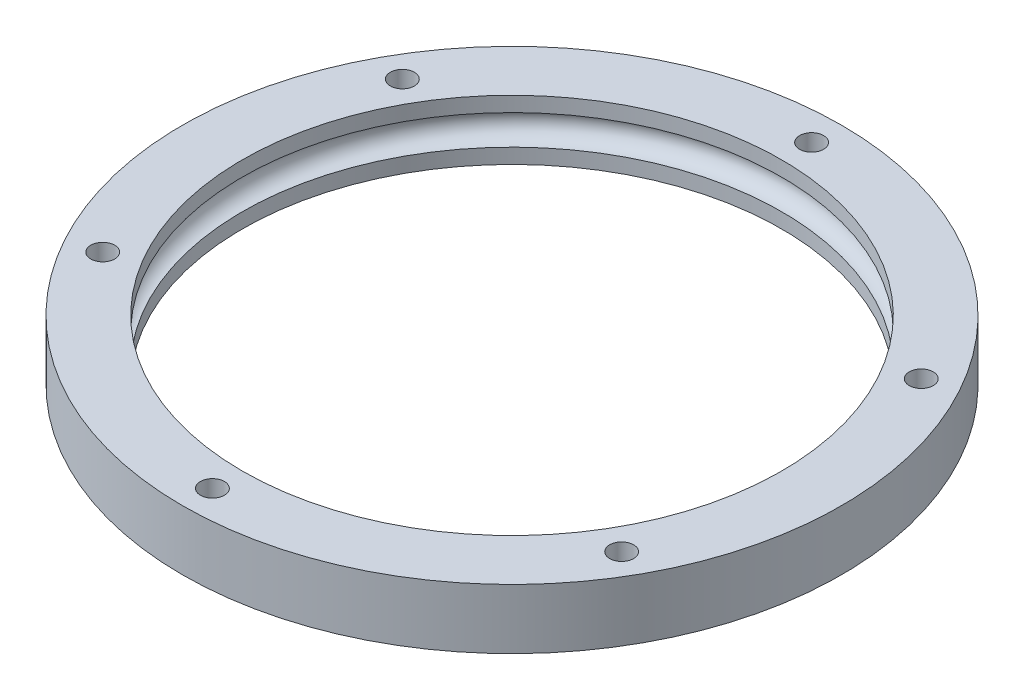
ISO-10303-21;
HEADER;
FILE_DESCRIPTION(('STEP AP214'),'2;1');
FILE_NAME('part.step','',(''),(''),'','','');
FILE_SCHEMA(('AUTOMOTIVE_DESIGN { 1 0 10303 214 1 1 1 1 }'));
ENDSEC;
DATA;
#1=APPLICATION_CONTEXT('core data for automotive mechanical design processes');
#2=APPLICATION_PROTOCOL_DEFINITION('international standard','automotive_design',2000,#1);
#3=PRODUCT_CONTEXT('',#1,'mechanical');
#4=PRODUCT('Part','Part','',(#3));
#5=PRODUCT_RELATED_PRODUCT_CATEGORY('part','',(#4));
#6=PRODUCT_DEFINITION_FORMATION('','',#4);
#7=PRODUCT_DEFINITION_CONTEXT('part definition',#1,'design');
#8=PRODUCT_DEFINITION('design','',#6,#7);
#9=PRODUCT_DEFINITION_SHAPE('','',#8);
#10=(LENGTH_UNIT() NAMED_UNIT(*) SI_UNIT(.MILLI.,.METRE.));
#11=(NAMED_UNIT(*) PLANE_ANGLE_UNIT() SI_UNIT($,.RADIAN.));
#12=(NAMED_UNIT(*) SI_UNIT($,.STERADIAN.) SOLID_ANGLE_UNIT());
#13=UNCERTAINTY_MEASURE_WITH_UNIT(LENGTH_MEASURE(1.E-05),#10,'distance_accuracy_value','');
#14=(GEOMETRIC_REPRESENTATION_CONTEXT(3) GLOBAL_UNCERTAINTY_ASSIGNED_CONTEXT((#13)) GLOBAL_UNIT_ASSIGNED_CONTEXT((#10,
#11,#12)) REPRESENTATION_CONTEXT('',''));
#15=CARTESIAN_POINT('',(0.,0.,0.));
#16=DIRECTION('',(0.,0.,1.));
#17=DIRECTION('',(1.,0.,0.));
#18=AXIS2_PLACEMENT_3D('',#15,#16,#17);
#19=CARTESIAN_POINT('',(0.,59.0708442602269,0.));
#20=DIRECTION('',(0.,1.,0.));
#21=DIRECTION('',(0.,0.,1.));
#22=AXIS2_PLACEMENT_3D('',#19,#20,#21);
#23=CYLINDRICAL_SURFACE('',#22,55.);
#24=CARTESIAN_POINT('',(0.,-5.,0.));
#25=DIRECTION('',(0.,1.,0.));
#26=DIRECTION('',(0.,0.,1.));
#27=AXIS2_PLACEMENT_3D('',#24,#25,#26);
#28=CIRCLE('',#27,55.);
#29=CARTESIAN_POINT('',(0.,-5.,55.));
#30=VERTEX_POINT('',#29);
#31=EDGE_CURVE('E10',#30,#30,#28,.T.);
#32=ORIENTED_EDGE('',*,*,#31,.T.);
#33=EDGE_LOOP('',(#32));
#34=FACE_BOUND('',#33,.T.);
#35=CARTESIAN_POINT('',(0.,5.,0.));
#36=DIRECTION('',(0.,1.,0.));
#37=DIRECTION('',(0.,0.,1.));
#38=AXIS2_PLACEMENT_3D('',#35,#36,#37);
#39=CIRCLE('',#38,55.);
#40=CARTESIAN_POINT('',(0.,5.,55.));
#41=VERTEX_POINT('',#40);
#42=EDGE_CURVE('E53',#41,#41,#39,.T.);
#43=ORIENTED_EDGE('',*,*,#42,.F.);
#44=EDGE_LOOP('',(#43));
#45=FACE_BOUND('',#44,.T.);
#46=ADVANCED_FACE('F31',(#34,#45),#23,.T.);
#47=CARTESIAN_POINT('',(0.,-5.,45.));
#48=DIRECTION('',(0.,-1.,0.));
#49=DIRECTION('',(0.,0.,-1.));
#50=AXIS2_PLACEMENT_3D('',#47,#48,#49);
#51=PLANE('',#50);
#52=CARTESIAN_POINT('',(-43.3012701892209,-5.,-24.9999999999981));
#53=DIRECTION('',(0.,1.,0.));
#54=DIRECTION('',(0.,0.,1.));
#55=AXIS2_PLACEMENT_3D('',#52,#53,#54);
#56=CIRCLE('',#55,2.00000000000215);
#57=CARTESIAN_POINT('',(-43.3012701892209,-5.,-22.999999999996));
#58=VERTEX_POINT('',#57);
#59=EDGE_CURVE('E84',#58,#58,#56,.T.);
#60=ORIENTED_EDGE('',*,*,#59,.T.);
#61=EDGE_LOOP('',(#60));
#62=FACE_BOUND('',#61,.T.);
#63=CARTESIAN_POINT('',(-43.3012701892187,-5.,25.0000000000019));
#64=DIRECTION('',(0.,1.,0.));
#65=DIRECTION('',(0.,0.,1.));
#66=AXIS2_PLACEMENT_3D('',#63,#64,#65);
#67=CIRCLE('',#66,2.00000000000406);
#68=CARTESIAN_POINT('',(-43.3012701892187,-5.,27.0000000000059));
#69=VERTEX_POINT('',#68);
#70=EDGE_CURVE('E78',#69,#69,#67,.T.);
#71=ORIENTED_EDGE('',*,*,#70,.T.);
#72=EDGE_LOOP('',(#71));
#73=FACE_BOUND('',#72,.T.);
#74=CARTESIAN_POINT('',(4.251010553249E-12,-5.,50.));
#75=DIRECTION('',(0.,1.,0.));
#76=DIRECTION('',(0.,0.,1.));
#77=AXIS2_PLACEMENT_3D('',#74,#75,#76);
#78=CIRCLE('',#77,2.0000000000044);
#79=CARTESIAN_POINT('',(4.251010553249E-12,-5.,52.0000000000044));
#80=VERTEX_POINT('',#79);
#81=EDGE_CURVE('E72',#80,#80,#78,.T.);
#82=ORIENTED_EDGE('',*,*,#81,.T.);
#83=EDGE_LOOP('',(#82));
#84=FACE_BOUND('',#83,.T.);
#85=CARTESIAN_POINT('',(43.3012701892251,-5.,24.9999999999982));
#86=DIRECTION('',(0.,1.,0.));
#87=DIRECTION('',(0.,0.,1.));
#88=AXIS2_PLACEMENT_3D('',#85,#86,#87);
#89=CIRCLE('',#88,2.00000000000274);
#90=CARTESIAN_POINT('',(43.3012701892251,-5.,27.0000000000009));
#91=VERTEX_POINT('',#90);
#92=EDGE_CURVE('E66',#91,#91,#89,.T.);
#93=ORIENTED_EDGE('',*,*,#92,.T.);
#94=EDGE_LOOP('',(#93));
#95=FACE_BOUND('',#94,.T.);
#96=CARTESIAN_POINT('',(43.301270189223,-5.,-25.0000000000019));
#97=DIRECTION('',(0.,1.,0.));
#98=DIRECTION('',(0.,0.,1.));
#99=AXIS2_PLACEMENT_3D('',#96,#97,#98);
#100=CIRCLE('',#99,2.0000000000006);
#101=CARTESIAN_POINT('',(43.301270189223,-5.,-23.0000000000012));
#102=VERTEX_POINT('',#101);
#103=EDGE_CURVE('E60',#102,#102,#100,.T.);
#104=ORIENTED_EDGE('',*,*,#103,.T.);
#105=EDGE_LOOP('',(#104));
#106=FACE_BOUND('',#105,.T.);
#107=CARTESIAN_POINT('',(0.,-5.,-50.));
#108=DIRECTION('',(0.,1.,0.));
#109=DIRECTION('',(0.,0.,1.));
#110=AXIS2_PLACEMENT_3D('',#107,#108,#109);
#111=CIRCLE('',#110,2.);
#112=CARTESIAN_POINT('',(0.,-5.,-48.));
#113=VERTEX_POINT('',#112);
#114=EDGE_CURVE('E56',#113,#113,#111,.T.);
#115=ORIENTED_EDGE('',*,*,#114,.T.);
#116=EDGE_LOOP('',(#115));
#117=FACE_BOUND('',#116,.T.);
#118=CARTESIAN_POINT('',(0.,-5.,0.));
#119=DIRECTION('',(0.,1.,0.));
#120=DIRECTION('',(0.,0.,1.));
#121=AXIS2_PLACEMENT_3D('',#118,#119,#120);
#122=CIRCLE('',#121,45.);
#123=CARTESIAN_POINT('',(0.,-5.,45.));
#124=VERTEX_POINT('',#123);
#125=EDGE_CURVE('E37',#124,#124,#122,.T.);
#126=ORIENTED_EDGE('',*,*,#125,.T.);
#127=EDGE_LOOP('',(#126));
#128=FACE_BOUND('',#127,.T.);
#129=ORIENTED_EDGE('',*,*,#31,.F.);
#130=EDGE_LOOP('',(#129));
#131=FACE_BOUND('',#130,.T.);
#132=ADVANCED_FACE('F93',(#62,#73,#84,#95,#106,#117,#128,#131),#51,.T.);
#133=CARTESIAN_POINT('',(0.,59.0708442602269,0.));
#134=DIRECTION('',(0.,1.,0.));
#135=DIRECTION('',(0.,0.,1.));
#136=AXIS2_PLACEMENT_3D('',#133,#134,#135);
#137=CYLINDRICAL_SURFACE('',#136,45.);
#138=CARTESIAN_POINT('',(0.,-2.5,0.));
#139=DIRECTION('',(0.,1.,0.));
#140=DIRECTION('',(0.,0.,1.));
#141=AXIS2_PLACEMENT_3D('',#138,#139,#140);
#142=CIRCLE('',#141,45.);
#143=CARTESIAN_POINT('',(0.,-2.5,45.));
#144=VERTEX_POINT('',#143);
#145=EDGE_CURVE('E41',#144,#144,#142,.T.);
#146=ORIENTED_EDGE('',*,*,#145,.T.);
#147=EDGE_LOOP('',(#146));
#148=FACE_BOUND('',#147,.T.);
#149=ORIENTED_EDGE('',*,*,#125,.F.);
#150=EDGE_LOOP('',(#149));
#151=FACE_BOUND('',#150,.T.);
#152=ADVANCED_FACE('F131',(#148,#151),#137,.F.);
#153=CARTESIAN_POINT('',(0.,0.,0.));
#154=DIRECTION('',(0.,1.,0.));
#155=DIRECTION('',(0.,0.,1.));
#156=AXIS2_PLACEMENT_3D('',#153,#154,#155);
#157=TOROIDAL_SURFACE('',#156,45.,2.5);
#158=CARTESIAN_POINT('',(0.,2.5,0.));
#159=DIRECTION('',(0.,1.,0.));
#160=DIRECTION('',(0.,0.,1.));
#161=AXIS2_PLACEMENT_3D('',#158,#159,#160);
#162=CIRCLE('',#161,45.);
#163=CARTESIAN_POINT('',(0.,2.5,45.));
#164=VERTEX_POINT('',#163);
#165=EDGE_CURVE('E45',#164,#164,#162,.T.);
#166=ORIENTED_EDGE('',*,*,#165,.T.);
#167=EDGE_LOOP('',(#166));
#168=FACE_BOUND('',#167,.T.);
#169=ORIENTED_EDGE('',*,*,#145,.F.);
#170=EDGE_LOOP('',(#169));
#171=FACE_BOUND('',#170,.T.);
#172=ADVANCED_FACE('F125',(#168,#171),#157,.F.);
#173=CARTESIAN_POINT('',(0.,59.0708442602269,0.));
#174=DIRECTION('',(0.,1.,0.));
#175=DIRECTION('',(0.,0.,1.));
#176=AXIS2_PLACEMENT_3D('',#173,#174,#175);
#177=CYLINDRICAL_SURFACE('',#176,45.);
#178=CARTESIAN_POINT('',(0.,5.,0.));
#179=DIRECTION('',(0.,1.,0.));
#180=DIRECTION('',(0.,0.,1.));
#181=AXIS2_PLACEMENT_3D('',#178,#179,#180);
#182=CIRCLE('',#181,45.);
#183=CARTESIAN_POINT('',(0.,5.,45.));
#184=VERTEX_POINT('',#183);
#185=EDGE_CURVE('E50',#184,#184,#182,.T.);
#186=ORIENTED_EDGE('',*,*,#185,.T.);
#187=EDGE_LOOP('',(#186));
#188=FACE_BOUND('',#187,.T.);
#189=ORIENTED_EDGE('',*,*,#165,.F.);
#190=EDGE_LOOP('',(#189));
#191=FACE_BOUND('',#190,.T.);
#192=ADVANCED_FACE('F107',(#188,#191),#177,.F.);
#193=CARTESIAN_POINT('',(0.,5.,45.));
#194=DIRECTION('',(0.,1.,0.));
#195=DIRECTION('',(0.,0.,1.));
#196=AXIS2_PLACEMENT_3D('',#193,#194,#195);
#197=PLANE('',#196);
#198=CARTESIAN_POINT('',(-43.3012701892209,5.,-24.9999999999981));
#199=DIRECTION('',(0.,1.,0.));
#200=DIRECTION('',(0.,0.,1.));
#201=AXIS2_PLACEMENT_3D('',#198,#199,#200);
#202=CIRCLE('',#201,2.00000000000215);
#203=CARTESIAN_POINT('',(-43.3012701892209,5.,-22.999999999996));
#204=VERTEX_POINT('',#203);
#205=EDGE_CURVE('E87',#204,#204,#202,.T.);
#206=ORIENTED_EDGE('',*,*,#205,.F.);
#207=EDGE_LOOP('',(#206));
#208=FACE_BOUND('',#207,.T.);
#209=CARTESIAN_POINT('',(-43.3012701892187,5.,25.0000000000019));
#210=DIRECTION('',(0.,1.,0.));
#211=DIRECTION('',(0.,0.,1.));
#212=AXIS2_PLACEMENT_3D('',#209,#210,#211);
#213=CIRCLE('',#212,2.00000000000406);
#214=CARTESIAN_POINT('',(-43.3012701892187,5.,27.0000000000059));
#215=VERTEX_POINT('',#214);
#216=EDGE_CURVE('E81',#215,#215,#213,.T.);
#217=ORIENTED_EDGE('',*,*,#216,.F.);
#218=EDGE_LOOP('',(#217));
#219=FACE_BOUND('',#218,.T.);
#220=CARTESIAN_POINT('',(4.251010553249E-12,5.,50.));
#221=DIRECTION('',(0.,1.,0.));
#222=DIRECTION('',(0.,0.,1.));
#223=AXIS2_PLACEMENT_3D('',#220,#221,#222);
#224=CIRCLE('',#223,2.0000000000044);
#225=CARTESIAN_POINT('',(4.251010553249E-12,5.,52.0000000000044));
#226=VERTEX_POINT('',#225);
#227=EDGE_CURVE('E75',#226,#226,#224,.T.);
#228=ORIENTED_EDGE('',*,*,#227,.F.);
#229=EDGE_LOOP('',(#228));
#230=FACE_BOUND('',#229,.T.);
#231=CARTESIAN_POINT('',(43.3012701892251,5.,24.9999999999982));
#232=DIRECTION('',(0.,1.,0.));
#233=DIRECTION('',(0.,0.,1.));
#234=AXIS2_PLACEMENT_3D('',#231,#232,#233);
#235=CIRCLE('',#234,2.00000000000274);
#236=CARTESIAN_POINT('',(43.3012701892251,5.,27.0000000000009));
#237=VERTEX_POINT('',#236);
#238=EDGE_CURVE('E69',#237,#237,#235,.T.);
#239=ORIENTED_EDGE('',*,*,#238,.F.);
#240=EDGE_LOOP('',(#239));
#241=FACE_BOUND('',#240,.T.);
#242=CARTESIAN_POINT('',(43.301270189223,5.,-25.0000000000019));
#243=DIRECTION('',(0.,1.,0.));
#244=DIRECTION('',(0.,0.,1.));
#245=AXIS2_PLACEMENT_3D('',#242,#243,#244);
#246=CIRCLE('',#245,2.0000000000006);
#247=CARTESIAN_POINT('',(43.301270189223,5.,-23.0000000000012));
#248=VERTEX_POINT('',#247);
#249=EDGE_CURVE('E63',#248,#248,#246,.T.);
#250=ORIENTED_EDGE('',*,*,#249,.F.);
#251=EDGE_LOOP('',(#250));
#252=FACE_BOUND('',#251,.T.);
#253=CARTESIAN_POINT('',(0.,5.,-50.));
#254=DIRECTION('',(0.,1.,0.));
#255=DIRECTION('',(0.,0.,1.));
#256=AXIS2_PLACEMENT_3D('',#253,#254,#255);
#257=CIRCLE('',#256,2.);
#258=CARTESIAN_POINT('',(0.,5.,-48.));
#259=VERTEX_POINT('',#258);
#260=EDGE_CURVE('E57',#259,#259,#257,.T.);
#261=ORIENTED_EDGE('',*,*,#260,.F.);
#262=EDGE_LOOP('',(#261));
#263=FACE_BOUND('',#262,.T.);
#264=ORIENTED_EDGE('',*,*,#42,.T.);
#265=EDGE_LOOP('',(#264));
#266=FACE_BOUND('',#265,.T.);
#267=ORIENTED_EDGE('',*,*,#185,.F.);
#268=EDGE_LOOP('',(#267));
#269=FACE_BOUND('',#268,.T.);
#270=ADVANCED_FACE('F103',(#208,#219,#230,#241,#252,#263,#266,#269),#197,.T.);
#271=CARTESIAN_POINT('',(0.,-5.,-50.));
#272=DIRECTION('',(0.,1.,0.));
#273=DIRECTION('',(0.,0.,1.));
#274=AXIS2_PLACEMENT_3D('',#271,#272,#273);
#275=CYLINDRICAL_SURFACE('',#274,2.);
#276=ORIENTED_EDGE('',*,*,#114,.F.);
#277=EDGE_LOOP('',(#276));
#278=FACE_BOUND('',#277,.T.);
#279=ORIENTED_EDGE('',*,*,#260,.T.);
#280=EDGE_LOOP('',(#279));
#281=FACE_BOUND('',#280,.T.);
#282=ADVANCED_FACE('F106',(#278,#281),#275,.F.);
#283=CARTESIAN_POINT('',(43.301270189223,-5.,-25.0000000000019));
#284=DIRECTION('',(0.,1.,0.));
#285=DIRECTION('',(0.,0.,1.));
#286=AXIS2_PLACEMENT_3D('',#283,#284,#285);
#287=CYLINDRICAL_SURFACE('',#286,2.0000000000006);
#288=ORIENTED_EDGE('',*,*,#103,.F.);
#289=EDGE_LOOP('',(#288));
#290=FACE_BOUND('',#289,.T.);
#291=ORIENTED_EDGE('',*,*,#249,.T.);
#292=EDGE_LOOP('',(#291));
#293=FACE_BOUND('',#292,.T.);
#294=ADVANCED_FACE('F169',(#290,#293),#287,.F.);
#295=CARTESIAN_POINT('',(43.3012701892251,-5.,24.9999999999982));
#296=DIRECTION('',(0.,1.,0.));
#297=DIRECTION('',(0.,0.,1.));
#298=AXIS2_PLACEMENT_3D('',#295,#296,#297);
#299=CYLINDRICAL_SURFACE('',#298,2.00000000000274);
#300=ORIENTED_EDGE('',*,*,#92,.F.);
#301=EDGE_LOOP('',(#300));
#302=FACE_BOUND('',#301,.T.);
#303=ORIENTED_EDGE('',*,*,#238,.T.);
#304=EDGE_LOOP('',(#303));
#305=FACE_BOUND('',#304,.T.);
#306=ADVANCED_FACE('F179',(#302,#305),#299,.F.);
#307=CARTESIAN_POINT('',(4.251010553249E-12,-5.,50.));
#308=DIRECTION('',(0.,1.,0.));
#309=DIRECTION('',(0.,0.,1.));
#310=AXIS2_PLACEMENT_3D('',#307,#308,#309);
#311=CYLINDRICAL_SURFACE('',#310,2.0000000000044);
#312=ORIENTED_EDGE('',*,*,#81,.F.);
#313=EDGE_LOOP('',(#312));
#314=FACE_BOUND('',#313,.T.);
#315=ORIENTED_EDGE('',*,*,#227,.T.);
#316=EDGE_LOOP('',(#315));
#317=FACE_BOUND('',#316,.T.);
#318=ADVANCED_FACE('F189',(#314,#317),#311,.F.);
#319=CARTESIAN_POINT('',(-43.3012701892187,-5.,25.0000000000019));
#320=DIRECTION('',(0.,1.,0.));
#321=DIRECTION('',(0.,0.,1.));
#322=AXIS2_PLACEMENT_3D('',#319,#320,#321);
#323=CYLINDRICAL_SURFACE('',#322,2.00000000000406);
#324=ORIENTED_EDGE('',*,*,#70,.F.);
#325=EDGE_LOOP('',(#324));
#326=FACE_BOUND('',#325,.T.);
#327=ORIENTED_EDGE('',*,*,#216,.T.);
#328=EDGE_LOOP('',(#327));
#329=FACE_BOUND('',#328,.T.);
#330=ADVANCED_FACE('F99',(#326,#329),#323,.F.);
#331=CARTESIAN_POINT('',(-43.3012701892209,-5.,-24.9999999999981));
#332=DIRECTION('',(0.,1.,0.));
#333=DIRECTION('',(0.,0.,1.));
#334=AXIS2_PLACEMENT_3D('',#331,#332,#333);
#335=CYLINDRICAL_SURFACE('',#334,2.00000000000215);
#336=ORIENTED_EDGE('',*,*,#59,.F.);
#337=EDGE_LOOP('',(#336));
#338=FACE_BOUND('',#337,.T.);
#339=ORIENTED_EDGE('',*,*,#205,.T.);
#340=EDGE_LOOP('',(#339));
#341=FACE_BOUND('',#340,.T.);
#342=ADVANCED_FACE('F96',(#338,#341),#335,.F.);
#343=CLOSED_SHELL('',(#46,#132,#152,#172,#192,#270,#282,#294,#306,#318,#330,#342));
#344=MANIFOLD_SOLID_BREP('B2',#343);
#345=ADVANCED_BREP_SHAPE_REPRESENTATION('',(#18,#344),#14);
#346=SHAPE_DEFINITION_REPRESENTATION(#9,#345);
ENDSEC;
END-ISO-10303-21;
